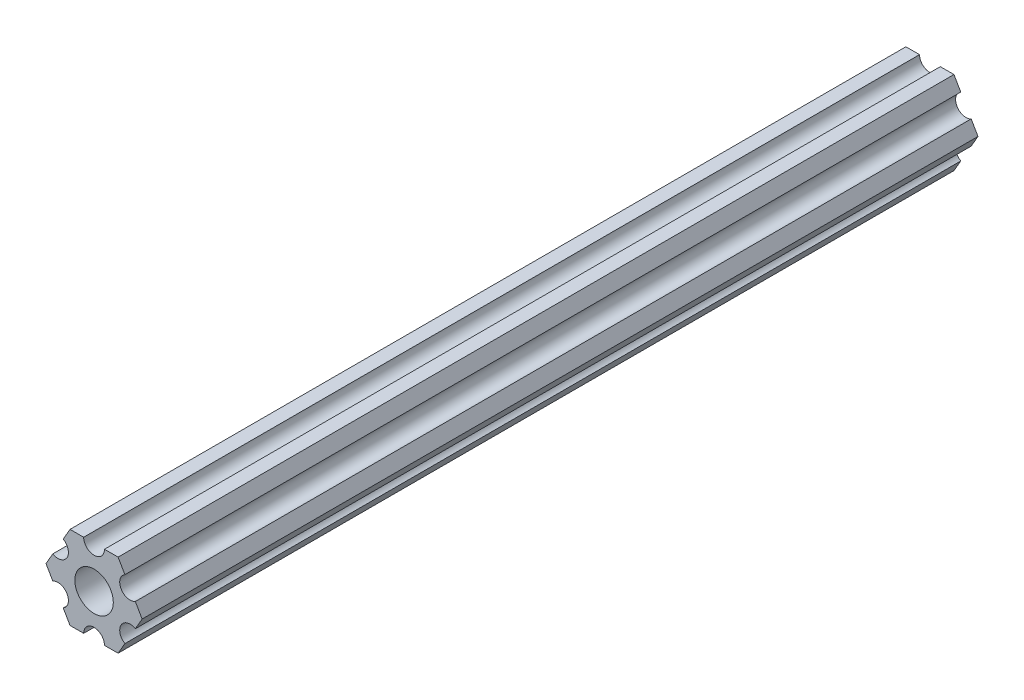
ISO-10303-21;
HEADER;
FILE_DESCRIPTION(('STEP AP214'),'2;1');
FILE_NAME('part.step','',(''),(''),'','','');
FILE_SCHEMA(('AUTOMOTIVE_DESIGN { 1 0 10303 214 1 1 1 1 }'));
ENDSEC;
DATA;
#1=APPLICATION_CONTEXT('core data for automotive mechanical design processes');
#2=APPLICATION_PROTOCOL_DEFINITION('international standard','automotive_design',2000,#1);
#3=PRODUCT_CONTEXT('',#1,'mechanical');
#4=PRODUCT('Part','Part','',(#3));
#5=PRODUCT_RELATED_PRODUCT_CATEGORY('part','',(#4));
#6=PRODUCT_DEFINITION_FORMATION('','',#4);
#7=PRODUCT_DEFINITION_CONTEXT('part definition',#1,'design');
#8=PRODUCT_DEFINITION('design','',#6,#7);
#9=PRODUCT_DEFINITION_SHAPE('','',#8);
#10=(LENGTH_UNIT() NAMED_UNIT(*) SI_UNIT(.MILLI.,.METRE.));
#11=(NAMED_UNIT(*) PLANE_ANGLE_UNIT() SI_UNIT($,.RADIAN.));
#12=(NAMED_UNIT(*) SI_UNIT($,.STERADIAN.) SOLID_ANGLE_UNIT());
#13=UNCERTAINTY_MEASURE_WITH_UNIT(LENGTH_MEASURE(1.E-05),#10,'distance_accuracy_value','');
#14=(GEOMETRIC_REPRESENTATION_CONTEXT(3) GLOBAL_UNCERTAINTY_ASSIGNED_CONTEXT((#13)) GLOBAL_UNIT_ASSIGNED_CONTEXT((#10,
#11,#12)) REPRESENTATION_CONTEXT('',''));
#15=CARTESIAN_POINT('',(0.,0.,0.));
#16=DIRECTION('',(0.,0.,1.));
#17=DIRECTION('',(1.,0.,0.));
#18=AXIS2_PLACEMENT_3D('',#15,#16,#17);
#19=CARTESIAN_POINT('',(6.29301142309098,-1.80018429024546,85.725));
#20=DIRECTION('',(-0.866025434075723,0.499999947533953,0.));
#21=DIRECTION('',(0.,0.,1.));
#22=AXIS2_PLACEMENT_3D('',#19,#20,#21);
#23=PLANE('',#22);
#24=DIRECTION('',(0.,0.,1.));
#25=VECTOR('',#24,1.);
#26=CARTESIAN_POINT('',(7.33234841870827,4.44212519169686E-07,85.725));
#27=LINE('',#26,#25);
#28=CARTESIAN_POINT('',(7.33234841870826,4.44212518961143E-07,0.));
#29=VERTEX_POINT('',#28);
#30=CARTESIAN_POINT('',(7.33234841870826,4.44212518961143E-07,127.508));
#31=VERTEX_POINT('',#30);
#32=EDGE_CURVE('E12',#29,#31,#27,.T.);
#33=ORIENTED_EDGE('',*,*,#32,.T.);
#34=DIRECTION('',(-0.499999947533953,-0.866025434075723,0.));
#35=VECTOR('',#34,1.);
#36=CARTESIAN_POINT('',(6.29301142309098,-1.80018429024546,127.508));
#37=LINE('',#36,#35);
#38=CARTESIAN_POINT('',(6.29301142309098,-1.80018429024546,127.508));
#39=VERTEX_POINT('',#38);
#40=EDGE_CURVE('E221',#31,#39,#37,.T.);
#41=ORIENTED_EDGE('',*,*,#40,.T.);
#42=DIRECTION('',(0.,0.,-1.));
#43=VECTOR('',#42,1.);
#44=CARTESIAN_POINT('',(6.29301142309098,-1.80018429024546,85.725));
#45=LINE('',#44,#43);
#46=CARTESIAN_POINT('',(6.29301142309098,-1.80018429024546,0.));
#47=VERTEX_POINT('',#46);
#48=EDGE_CURVE('E186',#39,#47,#45,.T.);
#49=ORIENTED_EDGE('',*,*,#48,.T.);
#50=DIRECTION('',(0.499999947533953,0.866025434075723,0.));
#51=VECTOR('',#50,1.);
#52=CARTESIAN_POINT('',(6.29301142309098,-1.80018429024546,0.));
#53=LINE('',#52,#51);
#54=EDGE_CURVE('E140',#47,#29,#53,.T.);
#55=ORIENTED_EDGE('',*,*,#54,.T.);
#56=EDGE_LOOP('',(#33,#41,#49,#55));
#57=FACE_BOUND('',#56,.T.);
#58=ADVANCED_FACE('F53',(#57),#23,.F.);
#59=CARTESIAN_POINT('',(7.33234841870827,4.44212519169686E-07,85.725));
#60=DIRECTION('',(-0.866025373493145,-0.500000052466057,0.));
#61=DIRECTION('',(-0.500000052466057,0.866025373493145,0.));
#62=AXIS2_PLACEMENT_3D('',#59,#60,#61);
#63=PLANE('',#62);
#64=DIRECTION('',(0.,0.,1.));
#65=VECTOR('',#64,1.);
#66=CARTESIAN_POINT('',(6.29301120497139,1.80018505273894,85.725));
#67=LINE('',#66,#65);
#68=CARTESIAN_POINT('',(6.29301120497139,1.80018505273894,0.));
#69=VERTEX_POINT('',#68);
#70=CARTESIAN_POINT('',(6.29301120497139,1.80018505273894,127.508));
#71=VERTEX_POINT('',#70);
#72=EDGE_CURVE('E63',#69,#71,#67,.T.);
#73=ORIENTED_EDGE('',*,*,#72,.T.);
#74=DIRECTION('',(0.500000052466055,-0.866025373493146,0.));
#75=VECTOR('',#74,1.);
#76=CARTESIAN_POINT('',(7.33234841870826,4.44212518961143E-07,127.508));
#77=LINE('',#76,#75);
#78=EDGE_CURVE('E216',#71,#31,#77,.T.);
#79=ORIENTED_EDGE('',*,*,#78,.T.);
#80=ORIENTED_EDGE('',*,*,#32,.F.);
#81=DIRECTION('',(-0.500000052466057,0.866025373493145,0.));
#82=VECTOR('',#81,1.);
#83=CARTESIAN_POINT('',(7.33234841870827,4.44212519198906E-07,0.));
#84=LINE('',#83,#82);
#85=EDGE_CURVE('E139',#29,#69,#84,.T.);
#86=ORIENTED_EDGE('',*,*,#85,.T.);
#87=EDGE_LOOP('',(#73,#79,#80,#86));
#88=FACE_BOUND('',#87,.T.);
#89=ADVANCED_FACE('F501',(#88),#63,.F.);
#90=CARTESIAN_POINT('',(4.70551103839172,4.54981561357972,85.725));
#91=DIRECTION('',(-0.866025373493151,-0.500000052466046,0.));
#92=DIRECTION('',(-0.500000052466046,0.866025373493151,0.));
#93=AXIS2_PLACEMENT_3D('',#90,#91,#92);
#94=PLANE('',#93);
#95=DIRECTION('',(0.,0.,1.));
#96=VECTOR('',#95,1.);
#97=CARTESIAN_POINT('',(3.66617382465481,6.35000022210627,85.725));
#98=LINE('',#97,#96);
#99=CARTESIAN_POINT('',(3.66617382465481,6.35000022210627,0.));
#100=VERTEX_POINT('',#99);
#101=CARTESIAN_POINT('',(3.66617382465481,6.35000022210627,127.508));
#102=VERTEX_POINT('',#101);
#103=EDGE_CURVE('E93',#100,#102,#98,.T.);
#104=ORIENTED_EDGE('',*,*,#103,.T.);
#105=DIRECTION('',(0.500000052466045,-0.866025373493151,0.));
#106=VECTOR('',#105,1.);
#107=CARTESIAN_POINT('',(4.70551103839172,4.54981561357972,127.508));
#108=LINE('',#107,#106);
#109=CARTESIAN_POINT('',(4.70551103839172,4.54981561357972,127.508));
#110=VERTEX_POINT('',#109);
#111=EDGE_CURVE('E228',#102,#110,#108,.T.);
#112=ORIENTED_EDGE('',*,*,#111,.T.);
#113=DIRECTION('',(0.,0.,1.));
#114=VECTOR('',#113,1.);
#115=CARTESIAN_POINT('',(4.70551103839172,4.54981561357972,85.725));
#116=LINE('',#115,#114);
#117=CARTESIAN_POINT('',(4.70551103839172,4.54981561357972,0.));
#118=VERTEX_POINT('',#117);
#119=EDGE_CURVE('E115',#118,#110,#116,.T.);
#120=ORIENTED_EDGE('',*,*,#119,.F.);
#121=DIRECTION('',(-0.500000052466046,0.866025373493151,0.));
#122=VECTOR('',#121,1.);
#123=CARTESIAN_POINT('',(4.70551103839172,4.54981561357972,0.));
#124=LINE('',#123,#122);
#125=EDGE_CURVE('E111',#118,#100,#124,.T.);
#126=ORIENTED_EDGE('',*,*,#125,.T.);
#127=EDGE_LOOP('',(#104,#112,#120,#126));
#128=FACE_BOUND('',#127,.T.);
#129=ADVANCED_FACE('F112',(#128),#94,.F.);
#130=CARTESIAN_POINT('',(3.66617382465481,6.35000022210627,85.725));
#131=DIRECTION('',(6.05825850611185E-08,-1.,0.));
#132=DIRECTION('',(0.,0.,-1.));
#133=AXIS2_PLACEMENT_3D('',#130,#131,#132);
#134=PLANE('',#133);
#135=DIRECTION('',(0.,0.,1.));
#136=VECTOR('',#135,1.);
#137=CARTESIAN_POINT('',(1.58749961530074,6.35000009617482,85.725));
#138=LINE('',#137,#136);
#139=CARTESIAN_POINT('',(1.58749961530073,6.35000015914054,0.));
#140=VERTEX_POINT('',#139);
#141=CARTESIAN_POINT('',(1.58749961530074,6.35,127.508));
#142=VERTEX_POINT('',#141);
#143=EDGE_CURVE('E107',#140,#142,#138,.T.);
#144=ORIENTED_EDGE('',*,*,#143,.T.);
#145=DIRECTION('',(1.,3.02912931564594E-08,0.));
#146=VECTOR('',#145,1.);
#147=CARTESIAN_POINT('',(3.66617382465481,6.35000022210627,127.508));
#148=LINE('',#147,#146);
#149=EDGE_CURVE('E102',#142,#102,#148,.T.);
#150=ORIENTED_EDGE('',*,*,#149,.T.);
#151=ORIENTED_EDGE('',*,*,#103,.F.);
#152=DIRECTION('',(-1.,0.,0.));
#153=VECTOR('',#152,1.);
#154=CARTESIAN_POINT('',(5.49926112168156,6.35000022210627,0.));
#155=LINE('',#154,#153);
#156=EDGE_CURVE('E98',#100,#140,#155,.T.);
#157=ORIENTED_EDGE('',*,*,#156,.T.);
#158=EDGE_LOOP('',(#144,#150,#151,#157));
#159=FACE_BOUND('',#158,.T.);
#160=ADVANCED_FACE('F96',(#159),#134,.F.);
#161=CARTESIAN_POINT('',(-3.84699260060323E-07,6.35,85.725));
#162=DIRECTION('',(0.,0.,-1.));
#163=DIRECTION('',(-1.,0.,0.));
#164=AXIS2_PLACEMENT_3D('',#161,#162,#163);
#165=CYLINDRICAL_SURFACE('',#164,1.5875);
#166=DIRECTION('',(0.,0.,1.));
#167=VECTOR('',#166,1.);
#168=CARTESIAN_POINT('',(-1.58750038469926,6.34999990382518,85.725));
#169=LINE('',#168,#167);
#170=CARTESIAN_POINT('',(-1.58750038469926,6.34999990382519,0.));
#171=VERTEX_POINT('',#170);
#172=CARTESIAN_POINT('',(-1.58750038469926,6.34999990382519,127.508));
#173=VERTEX_POINT('',#172);
#174=EDGE_CURVE('E175',#171,#173,#169,.T.);
#175=ORIENTED_EDGE('',*,*,#174,.T.);
#176=CARTESIAN_POINT('',(-3.84699260060323E-07,6.35,127.508));
#177=DIRECTION('',(0.,0.,1.));
#178=DIRECTION('',(1.,0.,0.));
#179=AXIS2_PLACEMENT_3D('',#176,#177,#178);
#180=CIRCLE('',#179,1.5875);
#181=EDGE_CURVE('E233',#173,#142,#180,.T.);
#182=ORIENTED_EDGE('',*,*,#181,.T.);
#183=ORIENTED_EDGE('',*,*,#143,.F.);
#184=CARTESIAN_POINT('',(-3.84699260060323E-07,6.35,0.));
#185=DIRECTION('',(0.,0.,-1.));
#186=DIRECTION('',(-1.,0.,0.));
#187=AXIS2_PLACEMENT_3D('',#184,#185,#186);
#188=CIRCLE('',#187,1.5875);
#189=EDGE_CURVE('E126',#140,#171,#188,.T.);
#190=ORIENTED_EDGE('',*,*,#189,.T.);
#191=EDGE_LOOP('',(#175,#182,#183,#190));
#192=FACE_BOUND('',#191,.T.);
#193=ADVANCED_FACE('F507',(#192),#165,.F.);
#194=CARTESIAN_POINT('',(-1.58750038469926,6.34999990382518,85.725));
#195=DIRECTION('',(6.05825963273174E-08,-1.,0.));
#196=DIRECTION('',(0.,0.,-1.));
#197=AXIS2_PLACEMENT_3D('',#194,#195,#196);
#198=PLANE('',#197);
#199=DIRECTION('',(0.,0.,1.));
#200=VECTOR('',#199,1.);
#201=CARTESIAN_POINT('',(-3.66617459405349,6.3499997778937,85.725));
#202=LINE('',#201,#200);
#203=CARTESIAN_POINT('',(-3.66617454558244,6.34999986184803,0.));
#204=VERTEX_POINT('',#203);
#205=CARTESIAN_POINT('',(-3.66617454558244,6.34999986184803,127.508));
#206=VERTEX_POINT('',#205);
#207=EDGE_CURVE('E171',#204,#206,#202,.T.);
#208=ORIENTED_EDGE('',*,*,#207,.T.);
#209=DIRECTION('',(1.,2.0194198968488E-08,0.));
#210=VECTOR('',#209,1.);
#211=CARTESIAN_POINT('',(-1.58750038469926,6.34999990382519,127.508));
#212=LINE('',#211,#210);
#213=EDGE_CURVE('E237',#206,#173,#212,.T.);
#214=ORIENTED_EDGE('',*,*,#213,.T.);
#215=ORIENTED_EDGE('',*,*,#174,.F.);
#216=DIRECTION('',(-1.,0.,0.));
#217=VECTOR('',#216,1.);
#218=CARTESIAN_POINT('',(5.49926112168156,6.34999990382519,0.));
#219=LINE('',#218,#217);
#220=EDGE_CURVE('E131',#171,#204,#219,.T.);
#221=ORIENTED_EDGE('',*,*,#220,.T.);
#222=EDGE_LOOP('',(#208,#214,#215,#221));
#223=FACE_BOUND('',#222,.T.);
#224=ADVANCED_FACE('F373',(#223),#198,.F.);
#225=CARTESIAN_POINT('',(-3.66617459405349,6.3499997778937,85.725));
#226=DIRECTION('',(0.866025434075729,-0.499999947533942,0.));
#227=DIRECTION('',(0.,0.,-1.));
#228=AXIS2_PLACEMENT_3D('',#225,#226,#227);
#229=PLANE('',#228);
#230=DIRECTION('',(0.,0.,1.));
#231=VECTOR('',#230,1.);
#232=CARTESIAN_POINT('',(-4.70551158967065,4.54981504343587,85.725));
#233=LINE('',#232,#231);
#234=CARTESIAN_POINT('',(-4.70551158967065,4.54981504343587,0.));
#235=VERTEX_POINT('',#234);
#236=CARTESIAN_POINT('',(-4.70551158967065,4.54981504343587,127.508));
#237=VERTEX_POINT('',#236);
#238=EDGE_CURVE('E170',#235,#237,#233,.T.);
#239=ORIENTED_EDGE('',*,*,#238,.T.);
#240=DIRECTION('',(0.499999947533939,0.866025434075731,0.));
#241=VECTOR('',#240,1.);
#242=CARTESIAN_POINT('',(-3.66617454558244,6.34999986184803,127.508));
#243=LINE('',#242,#241);
#244=EDGE_CURVE('E241',#237,#206,#243,.T.);
#245=ORIENTED_EDGE('',*,*,#244,.T.);
#246=ORIENTED_EDGE('',*,*,#207,.F.);
#247=DIRECTION('',(-0.499999947533943,-0.866025434075729,0.));
#248=VECTOR('',#247,1.);
#249=CARTESIAN_POINT('',(-3.66617459405349,6.3499997778937,0.));
#250=LINE('',#249,#248);
#251=EDGE_CURVE('E358',#204,#235,#250,.T.);
#252=ORIENTED_EDGE('',*,*,#251,.T.);
#253=EDGE_LOOP('',(#239,#245,#246,#252));
#254=FACE_BOUND('',#253,.T.);
#255=ADVANCED_FACE('F600',(#254),#229,.F.);
#256=CARTESIAN_POINT('',(-5.49926150638082,3.17499966684067,85.725));
#257=DIRECTION('',(0.,0.,-1.));
#258=DIRECTION('',(-1.,0.,0.));
#259=AXIS2_PLACEMENT_3D('',#256,#257,#258);
#260=CYLINDRICAL_SURFACE('',#259,1.5875);
#261=DIRECTION('',(0.,0.,1.));
#262=VECTOR('',#261,1.);
#263=CARTESIAN_POINT('',(-6.29301142309098,1.80018429024547,85.725));
#264=LINE('',#263,#262);
#265=CARTESIAN_POINT('',(-6.29301142309098,1.80018429024547,0.));
#266=VERTEX_POINT('',#265);
#267=CARTESIAN_POINT('',(-6.29301142309098,1.80018429024546,127.508));
#268=VERTEX_POINT('',#267);
#269=EDGE_CURVE('E148',#266,#268,#264,.T.);
#270=ORIENTED_EDGE('',*,*,#269,.T.);
#271=CARTESIAN_POINT('',(-5.49926150638082,3.17499966684067,127.508));
#272=DIRECTION('',(0.,0.,1.));
#273=DIRECTION('',(1.,0.,0.));
#274=AXIS2_PLACEMENT_3D('',#271,#272,#273);
#275=CIRCLE('',#274,1.5875);
#276=EDGE_CURVE('E245',#268,#237,#275,.T.);
#277=ORIENTED_EDGE('',*,*,#276,.T.);
#278=ORIENTED_EDGE('',*,*,#238,.F.);
#279=CARTESIAN_POINT('',(-5.49926150638082,3.17499966684067,0.));
#280=DIRECTION('',(0.,0.,-1.));
#281=DIRECTION('',(-1.,0.,0.));
#282=AXIS2_PLACEMENT_3D('',#279,#280,#281);
#283=CIRCLE('',#282,1.5875);
#284=EDGE_CURVE('E355',#235,#266,#283,.T.);
#285=ORIENTED_EDGE('',*,*,#284,.T.);
#286=EDGE_LOOP('',(#270,#277,#278,#285));
#287=FACE_BOUND('',#286,.T.);
#288=ADVANCED_FACE('F384',(#287),#260,.F.);
#289=CARTESIAN_POINT('',(-6.29301142309098,1.80018429024547,85.725));
#290=DIRECTION('',(0.866025434075724,-0.499999947533952,0.));
#291=DIRECTION('',(0.,0.,-1.));
#292=AXIS2_PLACEMENT_3D('',#289,#290,#291);
#293=PLANE('',#292);
#294=DIRECTION('',(0.,0.,1.));
#295=VECTOR('',#294,1.);
#296=CARTESIAN_POINT('',(-7.33234841870827,-4.44212523790841E-07,85.725));
#297=LINE('',#296,#295);
#298=CARTESIAN_POINT('',(-7.33234841870826,-4.44212524036367E-07,0.));
#299=VERTEX_POINT('',#298);
#300=CARTESIAN_POINT('',(-7.33234841870826,-4.44212524036367E-07,127.508));
#301=VERTEX_POINT('',#300);
#302=EDGE_CURVE('E144',#299,#301,#297,.T.);
#303=ORIENTED_EDGE('',*,*,#302,.T.);
#304=DIRECTION('',(0.499999947533951,0.866025434075724,0.));
#305=VECTOR('',#304,1.);
#306=CARTESIAN_POINT('',(-6.29301142309098,1.80018429024547,127.508));
#307=LINE('',#306,#305);
#308=EDGE_CURVE('E249',#301,#268,#307,.T.);
#309=ORIENTED_EDGE('',*,*,#308,.T.);
#310=ORIENTED_EDGE('',*,*,#269,.F.);
#311=DIRECTION('',(-0.499999947533952,-0.866025434075724,0.));
#312=VECTOR('',#311,1.);
#313=CARTESIAN_POINT('',(-6.29301142309098,1.80018429024547,0.));
#314=LINE('',#313,#312);
#315=EDGE_CURVE('E351',#266,#299,#314,.T.);
#316=ORIENTED_EDGE('',*,*,#315,.T.);
#317=EDGE_LOOP('',(#303,#309,#310,#316));
#318=FACE_BOUND('',#317,.T.);
#319=ADVANCED_FACE('F637',(#318),#293,.F.);
#320=CARTESIAN_POINT('',(-7.33234841870827,-4.44212523790841E-07,85.725));
#321=DIRECTION('',(0.866025373493151,0.500000052466045,0.));
#322=DIRECTION('',(0.,0.,-1.));
#323=AXIS2_PLACEMENT_3D('',#320,#321,#322);
#324=PLANE('',#323);
#325=DIRECTION('',(0.,0.,1.));
#326=VECTOR('',#325,1.);
#327=CARTESIAN_POINT('',(-6.29301120497141,-1.80018505273897,85.725));
#328=LINE('',#327,#326);
#329=CARTESIAN_POINT('',(-6.29301120497141,-1.80018505273897,0.));
#330=VERTEX_POINT('',#329);
#331=CARTESIAN_POINT('',(-6.29301120497141,-1.80018505273896,127.508));
#332=VERTEX_POINT('',#331);
#333=EDGE_CURVE('E149',#330,#332,#328,.T.);
#334=ORIENTED_EDGE('',*,*,#333,.T.);
#335=DIRECTION('',(-0.500000052466045,0.866025373493151,0.));
#336=VECTOR('',#335,1.);
#337=CARTESIAN_POINT('',(-7.33234841870826,-4.44212524036367E-07,127.508));
#338=LINE('',#337,#336);
#339=EDGE_CURVE('E253',#332,#301,#338,.T.);
#340=ORIENTED_EDGE('',*,*,#339,.T.);
#341=ORIENTED_EDGE('',*,*,#302,.F.);
#342=DIRECTION('',(0.500000052466045,-0.866025373493151,0.));
#343=VECTOR('',#342,1.);
#344=CARTESIAN_POINT('',(-7.33234841870827,-4.44212523969395E-07,0.));
#345=LINE('',#344,#343);
#346=EDGE_CURVE('E330',#299,#330,#345,.T.);
#347=ORIENTED_EDGE('',*,*,#346,.T.);
#348=EDGE_LOOP('',(#334,#340,#341,#347));
#349=FACE_BOUND('',#348,.T.);
#350=ADVANCED_FACE('F661',(#349),#324,.F.);
#351=CARTESIAN_POINT('',(-5.49926112168156,-3.17500033315934,85.725));
#352=DIRECTION('',(0.,0.,-1.));
#353=DIRECTION('',(-1.,0.,0.));
#354=AXIS2_PLACEMENT_3D('',#351,#352,#353);
#355=CYLINDRICAL_SURFACE('',#354,1.5875);
#356=DIRECTION('',(0.,0.,1.));
#357=VECTOR('',#356,1.);
#358=CARTESIAN_POINT('',(-4.70551103839172,-4.54981561357972,85.725));
#359=LINE('',#358,#357);
#360=CARTESIAN_POINT('',(-4.70551103839172,-4.54981561357972,0.));
#361=VERTEX_POINT('',#360);
#362=CARTESIAN_POINT('',(-4.70551103839172,-4.54981561357972,127.508));
#363=VERTEX_POINT('',#362);
#364=EDGE_CURVE('E163',#361,#363,#359,.T.);
#365=ORIENTED_EDGE('',*,*,#364,.T.);
#366=CARTESIAN_POINT('',(-5.49926112168156,-3.17500033315934,127.508));
#367=DIRECTION('',(0.,0.,1.));
#368=DIRECTION('',(1.,0.,0.));
#369=AXIS2_PLACEMENT_3D('',#366,#367,#368);
#370=CIRCLE('',#369,1.5875);
#371=EDGE_CURVE('E257',#363,#332,#370,.T.);
#372=ORIENTED_EDGE('',*,*,#371,.T.);
#373=ORIENTED_EDGE('',*,*,#333,.F.);
#374=CARTESIAN_POINT('',(-5.49926112168156,-3.17500033315934,0.));
#375=DIRECTION('',(0.,0.,-1.));
#376=DIRECTION('',(-1.,0.,0.));
#377=AXIS2_PLACEMENT_3D('',#374,#375,#376);
#378=CIRCLE('',#377,1.5875);
#379=EDGE_CURVE('E326',#330,#361,#378,.T.);
#380=ORIENTED_EDGE('',*,*,#379,.T.);
#381=EDGE_LOOP('',(#365,#372,#373,#380));
#382=FACE_BOUND('',#381,.T.);
#383=ADVANCED_FACE('F617',(#382),#355,.F.);
#384=CARTESIAN_POINT('',(-4.70551103839172,-4.54981561357972,85.725));
#385=DIRECTION('',(0.866025373493152,0.500000052466045,0.));
#386=DIRECTION('',(0.,0.,-1.));
#387=AXIS2_PLACEMENT_3D('',#384,#385,#386);
#388=PLANE('',#387);
#389=DIRECTION('',(0.,0.,1.));
#390=VECTOR('',#389,1.);
#391=CARTESIAN_POINT('',(-3.66617382465481,-6.35000022210628,85.725));
#392=LINE('',#391,#390);
#393=CARTESIAN_POINT('',(-3.66617382465481,-6.35000022210628,0.));
#394=VERTEX_POINT('',#393);
#395=CARTESIAN_POINT('',(-3.66617382465481,-6.35000022210628,127.508));
#396=VERTEX_POINT('',#395);
#397=EDGE_CURVE('E159',#394,#396,#392,.T.);
#398=ORIENTED_EDGE('',*,*,#397,.T.);
#399=DIRECTION('',(-0.500000052466043,0.866025373493153,0.));
#400=VECTOR('',#399,1.);
#401=CARTESIAN_POINT('',(-4.70551103839172,-4.54981561357972,127.508));
#402=LINE('',#401,#400);
#403=EDGE_CURVE('E261',#396,#363,#402,.T.);
#404=ORIENTED_EDGE('',*,*,#403,.T.);
#405=ORIENTED_EDGE('',*,*,#364,.F.);
#406=DIRECTION('',(0.500000052466045,-0.866025373493151,0.));
#407=VECTOR('',#406,1.);
#408=CARTESIAN_POINT('',(-4.70551103839172,-4.54981561357972,0.));
#409=LINE('',#408,#407);
#410=EDGE_CURVE('E331',#361,#394,#409,.T.);
#411=ORIENTED_EDGE('',*,*,#410,.T.);
#412=EDGE_LOOP('',(#398,#404,#405,#411));
#413=FACE_BOUND('',#412,.T.);
#414=ADVANCED_FACE('F612',(#413),#388,.F.);
#415=CARTESIAN_POINT('',(-3.66617382465481,-6.35000022210628,85.725));
#416=DIRECTION('',(-6.05825854783851E-08,1.,0.));
#417=DIRECTION('',(0.,0.,1.));
#418=AXIS2_PLACEMENT_3D('',#415,#416,#417);
#419=PLANE('',#418);
#420=DIRECTION('',(0.,0.,1.));
#421=VECTOR('',#420,1.);
#422=CARTESIAN_POINT('',(-1.58749961530074,-6.35,85.725));
#423=LINE('',#422,#421);
#424=CARTESIAN_POINT('',(-1.58749961530073,-6.35000011105314,0.));
#425=VERTEX_POINT('',#424);
#426=CARTESIAN_POINT('',(-1.58749961530073,-6.35000011105314,127.508));
#427=VERTEX_POINT('',#426);
#428=EDGE_CURVE('E158',#425,#427,#423,.T.);
#429=ORIENTED_EDGE('',*,*,#428,.T.);
#430=DIRECTION('',(-0.999999999999999,-5.34249856349037E-08,0.));
#431=VECTOR('',#430,1.);
#432=CARTESIAN_POINT('',(-3.66617382465481,-6.35000022210628,127.508));
#433=LINE('',#432,#431);
#434=EDGE_CURVE('E265',#427,#396,#433,.T.);
#435=ORIENTED_EDGE('',*,*,#434,.T.);
#436=ORIENTED_EDGE('',*,*,#397,.F.);
#437=DIRECTION('',(1.,0.,0.));
#438=VECTOR('',#437,1.);
#439=CARTESIAN_POINT('',(5.49926112168156,-6.35000022210628,0.));
#440=LINE('',#439,#438);
#441=EDGE_CURVE('E341',#394,#425,#440,.T.);
#442=ORIENTED_EDGE('',*,*,#441,.T.);
#443=EDGE_LOOP('',(#429,#435,#436,#442));
#444=FACE_BOUND('',#443,.T.);
#445=ADVANCED_FACE('F616',(#444),#419,.F.);
#446=CARTESIAN_POINT('',(3.8469926204343E-07,-6.35,85.725));
#447=DIRECTION('',(0.,0.,-1.));
#448=DIRECTION('',(-1.,0.,0.));
#449=AXIS2_PLACEMENT_3D('',#446,#447,#448);
#450=CYLINDRICAL_SURFACE('',#449,1.5875);
#451=DIRECTION('',(0.,0.,1.));
#452=VECTOR('',#451,1.);
#453=CARTESIAN_POINT('',(1.58750038469926,-6.34999990382518,85.725));
#454=LINE('',#453,#452);
#455=CARTESIAN_POINT('',(1.58750038469926,-6.34999990382519,0.));
#456=VERTEX_POINT('',#455);
#457=CARTESIAN_POINT('',(1.58750038469926,-6.34999990382519,127.508));
#458=VERTEX_POINT('',#457);
#459=EDGE_CURVE('E154',#456,#458,#454,.T.);
#460=ORIENTED_EDGE('',*,*,#459,.T.);
#461=CARTESIAN_POINT('',(3.8469926204343E-07,-6.35,127.508));
#462=DIRECTION('',(0.,0.,1.));
#463=DIRECTION('',(1.,0.,0.));
#464=AXIS2_PLACEMENT_3D('',#461,#462,#463);
#465=CIRCLE('',#464,1.5875);
#466=EDGE_CURVE('E269',#458,#427,#465,.T.);
#467=ORIENTED_EDGE('',*,*,#466,.T.);
#468=ORIENTED_EDGE('',*,*,#428,.F.);
#469=CARTESIAN_POINT('',(3.8469926204343E-07,-6.35,0.));
#470=DIRECTION('',(0.,0.,-1.));
#471=DIRECTION('',(-1.,0.,0.));
#472=AXIS2_PLACEMENT_3D('',#469,#470,#471);
#473=CIRCLE('',#472,1.5875);
#474=EDGE_CURVE('E303',#425,#456,#473,.T.);
#475=ORIENTED_EDGE('',*,*,#474,.T.);
#476=EDGE_LOOP('',(#460,#467,#468,#475));
#477=FACE_BOUND('',#476,.T.);
#478=ADVANCED_FACE('F628',(#477),#450,.F.);
#479=CARTESIAN_POINT('',(1.58750038469926,-6.34999990382518,85.725));
#480=DIRECTION('',(-6.05825721258438E-08,1.,0.));
#481=DIRECTION('',(0.,0.,1.));
#482=AXIS2_PLACEMENT_3D('',#479,#480,#481);
#483=PLANE('',#482);
#484=DIRECTION('',(0.,0.,1.));
#485=VECTOR('',#484,1.);
#486=CARTESIAN_POINT('',(3.66617459405346,-6.34999977789375,85.725));
#487=LINE('',#486,#485);
#488=CARTESIAN_POINT('',(3.66617454558244,-6.34999986184804,0.));
#489=VERTEX_POINT('',#488);
#490=CARTESIAN_POINT('',(3.66617454558244,-6.34999986184804,127.508));
#491=VERTEX_POINT('',#490);
#492=EDGE_CURVE('E153',#489,#491,#487,.T.);
#493=ORIENTED_EDGE('',*,*,#492,.T.);
#494=DIRECTION('',(-1.,-2.01941943785532E-08,0.));
#495=VECTOR('',#494,1.);
#496=CARTESIAN_POINT('',(1.58750038469926,-6.34999990382519,127.508));
#497=LINE('',#496,#495);
#498=EDGE_CURVE('E273',#491,#458,#497,.T.);
#499=ORIENTED_EDGE('',*,*,#498,.T.);
#500=ORIENTED_EDGE('',*,*,#459,.F.);
#501=DIRECTION('',(1.,0.,0.));
#502=VECTOR('',#501,1.);
#503=CARTESIAN_POINT('',(5.49926112168156,-6.34999990382519,0.));
#504=LINE('',#503,#502);
#505=EDGE_CURVE('E300',#456,#489,#504,.T.);
#506=ORIENTED_EDGE('',*,*,#505,.T.);
#507=EDGE_LOOP('',(#493,#499,#500,#506));
#508=FACE_BOUND('',#507,.T.);
#509=ADVANCED_FACE('F623',(#508),#483,.F.);
#510=CARTESIAN_POINT('',(3.66617459405346,-6.34999977789375,85.725));
#511=DIRECTION('',(-0.86602543407573,0.499999947533941,0.));
#512=DIRECTION('',(0.,0.,1.));
#513=AXIS2_PLACEMENT_3D('',#510,#511,#512);
#514=PLANE('',#513);
#515=DIRECTION('',(0.,0.,-1.));
#516=VECTOR('',#515,1.);
#517=CARTESIAN_POINT('',(4.70551158967065,-4.54981504343587,85.725));
#518=LINE('',#517,#516);
#519=CARTESIAN_POINT('',(4.70551158967065,-4.54981504343587,127.508));
#520=VERTEX_POINT('',#519);
#521=CARTESIAN_POINT('',(4.70551158967065,-4.54981504343587,0.));
#522=VERTEX_POINT('',#521);
#523=EDGE_CURVE('E143',#520,#522,#518,.T.);
#524=ORIENTED_EDGE('',*,*,#523,.F.);
#525=DIRECTION('',(-0.499999947533941,-0.86602543407573,0.));
#526=VECTOR('',#525,1.);
#527=CARTESIAN_POINT('',(3.66617454558244,-6.34999986184804,127.508));
#528=LINE('',#527,#526);
#529=EDGE_CURVE('E277',#520,#491,#528,.T.);
#530=ORIENTED_EDGE('',*,*,#529,.T.);
#531=ORIENTED_EDGE('',*,*,#492,.F.);
#532=DIRECTION('',(0.49999994753394,0.86602543407573,0.));
#533=VECTOR('',#532,1.);
#534=CARTESIAN_POINT('',(3.66617459405346,-6.34999977789376,0.));
#535=LINE('',#534,#533);
#536=EDGE_CURVE('E294',#489,#522,#535,.T.);
#537=ORIENTED_EDGE('',*,*,#536,.T.);
#538=EDGE_LOOP('',(#524,#530,#531,#537));
#539=FACE_BOUND('',#538,.T.);
#540=ADVANCED_FACE('F627',(#539),#514,.F.);
#541=CARTESIAN_POINT('',(5.49926112168156,3.17500033315934,0.));
#542=DIRECTION('',(0.,0.,1.));
#543=DIRECTION('',(1.,0.,0.));
#544=AXIS2_PLACEMENT_3D('',#541,#542,#543);
#545=PLANE('',#544);
#546=CARTESIAN_POINT('',(0.,0.,0.));
#547=DIRECTION('',(0.,0.,1.));
#548=DIRECTION('',(-1.,0.,0.));
#549=AXIS2_PLACEMENT_3D('',#546,#547,#548);
#550=CIRCLE('',#549,2.9337);
#551=CARTESIAN_POINT('',(-2.9337,0.,0.));
#552=VERTEX_POINT('',#551);
#553=CARTESIAN_POINT('',(2.9337,0.,0.));
#554=VERTEX_POINT('',#553);
#555=EDGE_CURVE('E200',#552,#554,#550,.T.);
#556=ORIENTED_EDGE('',*,*,#555,.T.);
#557=CARTESIAN_POINT('',(0.,0.,0.));
#558=DIRECTION('',(0.,0.,1.));
#559=DIRECTION('',(-1.,0.,0.));
#560=AXIS2_PLACEMENT_3D('',#557,#558,#559);
#561=CIRCLE('',#560,2.9337);
#562=EDGE_CURVE('E295',#554,#552,#561,.T.);
#563=ORIENTED_EDGE('',*,*,#562,.T.);
#564=EDGE_LOOP('',(#556,#563));
#565=FACE_BOUND('',#564,.T.);
#566=CARTESIAN_POINT('',(5.49926150638082,-3.17499966684067,0.));
#567=DIRECTION('',(0.,0.,-1.));
#568=DIRECTION('',(-1.,0.,0.));
#569=AXIS2_PLACEMENT_3D('',#566,#567,#568);
#570=CIRCLE('',#569,1.5875);
#571=CARTESIAN_POINT('',(3.91176150638082,-3.17499966684067,0.));
#572=VERTEX_POINT('',#571);
#573=EDGE_CURVE('E291',#522,#572,#570,.T.);
#574=ORIENTED_EDGE('',*,*,#573,.F.);
#575=ORIENTED_EDGE('',*,*,#536,.F.);
#576=ORIENTED_EDGE('',*,*,#505,.F.);
#577=ORIENTED_EDGE('',*,*,#474,.F.);
#578=ORIENTED_EDGE('',*,*,#441,.F.);
#579=ORIENTED_EDGE('',*,*,#410,.F.);
#580=ORIENTED_EDGE('',*,*,#379,.F.);
#581=ORIENTED_EDGE('',*,*,#346,.F.);
#582=ORIENTED_EDGE('',*,*,#315,.F.);
#583=ORIENTED_EDGE('',*,*,#284,.F.);
#584=ORIENTED_EDGE('',*,*,#251,.F.);
#585=ORIENTED_EDGE('',*,*,#220,.F.);
#586=ORIENTED_EDGE('',*,*,#189,.F.);
#587=ORIENTED_EDGE('',*,*,#156,.F.);
#588=ORIENTED_EDGE('',*,*,#125,.F.);
#589=CARTESIAN_POINT('',(5.49926112168156,3.17500033315934,0.));
#590=DIRECTION('',(0.,0.,-1.));
#591=DIRECTION('',(-1.,0.,0.));
#592=AXIS2_PLACEMENT_3D('',#589,#590,#591);
#593=CIRCLE('',#592,1.5875);
#594=CARTESIAN_POINT('',(3.91176112168156,3.17500033315934,0.));
#595=VERTEX_POINT('',#594);
#596=EDGE_CURVE('E185',#595,#118,#593,.T.);
#597=ORIENTED_EDGE('',*,*,#596,.F.);
#598=CARTESIAN_POINT('',(5.49926112168156,3.17500033315934,0.));
#599=DIRECTION('',(0.,0.,-1.));
#600=DIRECTION('',(-1.,0.,0.));
#601=AXIS2_PLACEMENT_3D('',#598,#599,#600);
#602=CIRCLE('',#601,1.5875);
#603=EDGE_CURVE('E120',#69,#595,#602,.T.);
#604=ORIENTED_EDGE('',*,*,#603,.F.);
#605=ORIENTED_EDGE('',*,*,#85,.F.);
#606=ORIENTED_EDGE('',*,*,#54,.F.);
#607=CARTESIAN_POINT('',(5.49926150638082,-3.17499966684067,0.));
#608=DIRECTION('',(0.,0.,-1.));
#609=DIRECTION('',(-1.,0.,0.));
#610=AXIS2_PLACEMENT_3D('',#607,#608,#609);
#611=CIRCLE('',#610,1.5875);
#612=EDGE_CURVE('E193',#572,#47,#611,.T.);
#613=ORIENTED_EDGE('',*,*,#612,.F.);
#614=EDGE_LOOP('',(#574,#575,#576,#577,#578,#579,#580,#581,#582,#583,#584,#585,#586,#587,#588,
#597,#604,#605,#606,#613));
#615=FACE_BOUND('',#614,.T.);
#616=ADVANCED_FACE('F123',(#565,#615),#545,.F.);
#617=CARTESIAN_POINT('',(5.49926112168156,3.17500033315934,85.725));
#618=DIRECTION('',(0.,0.,-1.));
#619=DIRECTION('',(-1.,0.,0.));
#620=AXIS2_PLACEMENT_3D('',#617,#618,#619);
#621=CYLINDRICAL_SURFACE('',#620,1.5875);
#622=ORIENTED_EDGE('',*,*,#119,.T.);
#623=CARTESIAN_POINT('',(5.49926112168156,3.17500033315934,127.508));
#624=DIRECTION('',(0.,0.,1.));
#625=DIRECTION('',(1.,0.,0.));
#626=AXIS2_PLACEMENT_3D('',#623,#624,#625);
#627=CIRCLE('',#626,1.5875);
#628=EDGE_CURVE('E224',#110,#71,#627,.T.);
#629=ORIENTED_EDGE('',*,*,#628,.T.);
#630=ORIENTED_EDGE('',*,*,#72,.F.);
#631=ORIENTED_EDGE('',*,*,#603,.T.);
#632=DIRECTION('',(0.,0.,-1.));
#633=VECTOR('',#632,1.);
#634=CARTESIAN_POINT('',(3.91176112168156,3.17500033315934,85.725));
#635=LINE('',#634,#633);
#636=CARTESIAN_POINT('',(3.91176112168156,3.17500033315934,85.725));
#637=VERTEX_POINT('',#636);
#638=EDGE_CURVE('E181',#637,#595,#635,.T.);
#639=ORIENTED_EDGE('',*,*,#638,.F.);
#640=ORIENTED_EDGE('',*,*,#638,.T.);
#641=ORIENTED_EDGE('',*,*,#596,.T.);
#642=EDGE_LOOP('',(#622,#629,#630,#631,#639,#640,#641));
#643=FACE_BOUND('',#642,.T.);
#644=ADVANCED_FACE('F504',(#643),#621,.F.);
#645=CARTESIAN_POINT('',(5.49926150638082,-3.17499966684067,85.725));
#646=DIRECTION('',(0.,0.,-1.));
#647=DIRECTION('',(-1.,0.,0.));
#648=AXIS2_PLACEMENT_3D('',#645,#646,#647);
#649=CYLINDRICAL_SURFACE('',#648,1.5875);
#650=ORIENTED_EDGE('',*,*,#48,.F.);
#651=CARTESIAN_POINT('',(5.49926150638082,-3.17499966684067,127.508));
#652=DIRECTION('',(0.,0.,1.));
#653=DIRECTION('',(1.,0.,0.));
#654=AXIS2_PLACEMENT_3D('',#651,#652,#653);
#655=CIRCLE('',#654,1.5875);
#656=EDGE_CURVE('E281',#39,#520,#655,.T.);
#657=ORIENTED_EDGE('',*,*,#656,.T.);
#658=ORIENTED_EDGE('',*,*,#523,.T.);
#659=ORIENTED_EDGE('',*,*,#573,.T.);
#660=DIRECTION('',(0.,0.,-1.));
#661=VECTOR('',#660,1.);
#662=CARTESIAN_POINT('',(3.91176150638082,-3.17499966684067,85.725));
#663=LINE('',#662,#661);
#664=CARTESIAN_POINT('',(3.91176150638082,-3.17499966684067,85.725));
#665=VERTEX_POINT('',#664);
#666=EDGE_CURVE('E189',#665,#572,#663,.T.);
#667=ORIENTED_EDGE('',*,*,#666,.F.);
#668=ORIENTED_EDGE('',*,*,#666,.T.);
#669=ORIENTED_EDGE('',*,*,#612,.T.);
#670=EDGE_LOOP('',(#650,#657,#658,#659,#667,#668,#669));
#671=FACE_BOUND('',#670,.T.);
#672=ADVANCED_FACE('F693',(#671),#649,.F.);
#673=CARTESIAN_POINT('',(0.,0.,85.725));
#674=DIRECTION('',(0.,0.,-1.));
#675=DIRECTION('',(-1.,0.,0.));
#676=AXIS2_PLACEMENT_3D('',#673,#674,#675);
#677=CYLINDRICAL_SURFACE('',#676,2.9337);
#678=DIRECTION('',(0.,0.,-1.));
#679=VECTOR('',#678,1.);
#680=CARTESIAN_POINT('',(-2.9337,0.,85.725));
#681=LINE('',#680,#679);
#682=CARTESIAN_POINT('',(-2.9337,0.,85.725));
#683=VERTEX_POINT('',#682);
#684=EDGE_CURVE('E194',#683,#552,#681,.T.);
#685=ORIENTED_EDGE('',*,*,#684,.F.);
#686=ORIENTED_EDGE('',*,*,#684,.T.);
#687=ORIENTED_EDGE('',*,*,#562,.F.);
#688=DIRECTION('',(0.,0.,-1.));
#689=VECTOR('',#688,1.);
#690=CARTESIAN_POINT('',(2.9337,0.,85.725));
#691=LINE('',#690,#689);
#692=CARTESIAN_POINT('',(2.9337,0.,85.725));
#693=VERTEX_POINT('',#692);
#694=EDGE_CURVE('E202',#693,#554,#691,.T.);
#695=ORIENTED_EDGE('',*,*,#694,.F.);
#696=ORIENTED_EDGE('',*,*,#694,.T.);
#697=ORIENTED_EDGE('',*,*,#555,.F.);
#698=EDGE_LOOP('',(#685,#686,#687,#695,#696,#697));
#699=FACE_BOUND('',#698,.T.);
#700=CARTESIAN_POINT('',(0.,0.,127.508));
#701=DIRECTION('',(0.,0.,1.));
#702=DIRECTION('',(1.,0.,0.));
#703=AXIS2_PLACEMENT_3D('',#700,#701,#702);
#704=CIRCLE('',#703,2.9337);
#705=CARTESIAN_POINT('',(2.9337,0.,127.508));
#706=VERTEX_POINT('',#705);
#707=EDGE_CURVE('E205',#706,#706,#704,.F.);
#708=ORIENTED_EDGE('',*,*,#707,.F.);
#709=EDGE_LOOP('',(#708));
#710=FACE_BOUND('',#709,.T.);
#711=ADVANCED_FACE('F701',(#699,#710),#677,.F.);
#712=CARTESIAN_POINT('',(5.49926112168156,3.17500033315934,127.508));
#713=DIRECTION('',(0.,0.,1.));
#714=DIRECTION('',(1.,0.,0.));
#715=AXIS2_PLACEMENT_3D('',#712,#713,#714);
#716=PLANE('',#715);
#717=ORIENTED_EDGE('',*,*,#628,.F.);
#718=ORIENTED_EDGE('',*,*,#111,.F.);
#719=ORIENTED_EDGE('',*,*,#149,.F.);
#720=ORIENTED_EDGE('',*,*,#181,.F.);
#721=ORIENTED_EDGE('',*,*,#213,.F.);
#722=ORIENTED_EDGE('',*,*,#244,.F.);
#723=ORIENTED_EDGE('',*,*,#276,.F.);
#724=ORIENTED_EDGE('',*,*,#308,.F.);
#725=ORIENTED_EDGE('',*,*,#339,.F.);
#726=ORIENTED_EDGE('',*,*,#371,.F.);
#727=ORIENTED_EDGE('',*,*,#403,.F.);
#728=ORIENTED_EDGE('',*,*,#434,.F.);
#729=ORIENTED_EDGE('',*,*,#466,.F.);
#730=ORIENTED_EDGE('',*,*,#498,.F.);
#731=ORIENTED_EDGE('',*,*,#529,.F.);
#732=ORIENTED_EDGE('',*,*,#656,.F.);
#733=ORIENTED_EDGE('',*,*,#40,.F.);
#734=ORIENTED_EDGE('',*,*,#78,.F.);
#735=EDGE_LOOP('',(#717,#718,#719,#720,#721,#722,#723,#724,#725,#726,#727,#728,#729,#730,#731,
#732,#733,#734));
#736=FACE_BOUND('',#735,.T.);
#737=ORIENTED_EDGE('',*,*,#707,.T.);
#738=EDGE_LOOP('',(#737));
#739=FACE_BOUND('',#738,.T.);
#740=ADVANCED_FACE('F499',(#736,#739),#716,.T.);
#741=CLOSED_SHELL('',(#58,#89,#129,#160,#193,#224,#255,#288,#319,#350,#383,#414,#445,#478,#509,
#540,#616,#644,#672,#711,#740));
#742=MANIFOLD_SOLID_BREP('B2',#741);
#743=ADVANCED_BREP_SHAPE_REPRESENTATION('',(#18,#742),#14);
#744=SHAPE_DEFINITION_REPRESENTATION(#9,#743);
ENDSEC;
END-ISO-10303-21;
